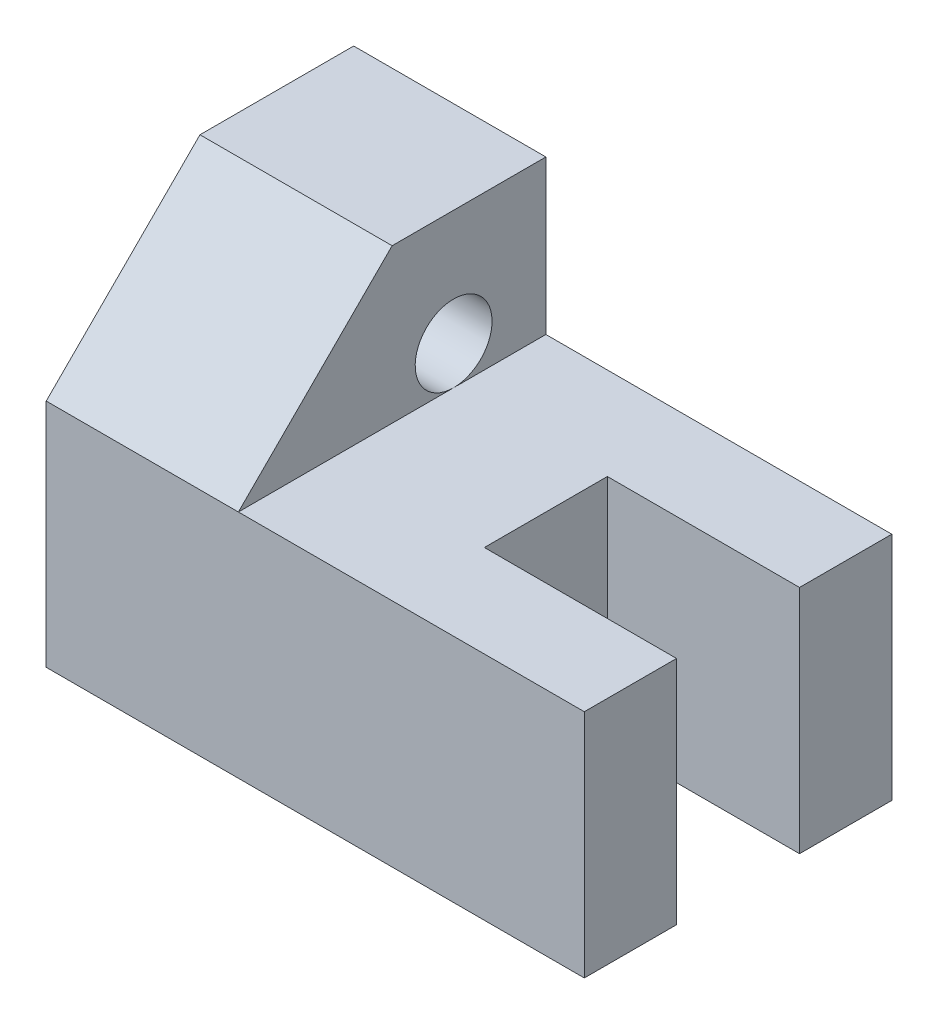
ISO-10303-21;
HEADER;
FILE_DESCRIPTION(('STEP AP214'),'2;1');
FILE_NAME('part.step','',(''),(''),'','','');
FILE_SCHEMA(('AUTOMOTIVE_DESIGN { 1 0 10303 214 1 1 1 1 }'));
ENDSEC;
DATA;
#1=APPLICATION_CONTEXT('core data for automotive mechanical design processes');
#2=APPLICATION_PROTOCOL_DEFINITION('international standard','automotive_design',2000,#1);
#3=PRODUCT_CONTEXT('',#1,'mechanical');
#4=PRODUCT('Part','Part','',(#3));
#5=PRODUCT_RELATED_PRODUCT_CATEGORY('part','',(#4));
#6=PRODUCT_DEFINITION_FORMATION('','',#4);
#7=PRODUCT_DEFINITION_CONTEXT('part definition',#1,'design');
#8=PRODUCT_DEFINITION('design','',#6,#7);
#9=PRODUCT_DEFINITION_SHAPE('','',#8);
#10=(LENGTH_UNIT() NAMED_UNIT(*) SI_UNIT(.MILLI.,.METRE.));
#11=(NAMED_UNIT(*) PLANE_ANGLE_UNIT() SI_UNIT($,.RADIAN.));
#12=(NAMED_UNIT(*) SI_UNIT($,.STERADIAN.) SOLID_ANGLE_UNIT());
#13=UNCERTAINTY_MEASURE_WITH_UNIT(LENGTH_MEASURE(1.E-05),#10,'distance_accuracy_value','');
#14=(GEOMETRIC_REPRESENTATION_CONTEXT(3) GLOBAL_UNCERTAINTY_ASSIGNED_CONTEXT((#13)) GLOBAL_UNIT_ASSIGNED_CONTEXT((#10,
#11,#12)) REPRESENTATION_CONTEXT('',''));
#15=CARTESIAN_POINT('',(0.,0.,0.));
#16=DIRECTION('',(0.,0.,1.));
#17=DIRECTION('',(1.,0.,0.));
#18=AXIS2_PLACEMENT_3D('',#15,#16,#17);
#19=CARTESIAN_POINT('',(0.,30.,0.));
#20=DIRECTION('',(0.,-1.,0.));
#21=DIRECTION('',(0.,0.,-1.));
#22=AXIS2_PLACEMENT_3D('',#19,#20,#21);
#23=PLANE('',#22);
#24=DIRECTION('',(0.,0.,-1.));
#25=VECTOR('',#24,1.);
#26=CARTESIAN_POINT('',(25.,30.,0.));
#27=LINE('',#26,#25);
#28=CARTESIAN_POINT('',(25.,30.,12.));
#29=VERTEX_POINT('',#28);
#30=CARTESIAN_POINT('',(25.,30.,0.));
#31=VERTEX_POINT('',#30);
#32=EDGE_CURVE('E141',#29,#31,#27,.T.);
#33=ORIENTED_EDGE('',*,*,#32,.F.);
#34=CARTESIAN_POINT('',(25.,30.,40.));
#35=VERTEX_POINT('',#34);
#36=EDGE_CURVE('E73',#35,#29,#27,.T.);
#37=ORIENTED_EDGE('',*,*,#36,.F.);
#38=DIRECTION('',(1.,0.,0.));
#39=VECTOR('',#38,1.);
#40=CARTESIAN_POINT('',(70.,30.,40.));
#41=LINE('',#40,#39);
#42=CARTESIAN_POINT('',(70.,30.,40.));
#43=VERTEX_POINT('',#42);
#44=EDGE_CURVE('E215',#35,#43,#41,.T.);
#45=ORIENTED_EDGE('',*,*,#44,.T.);
#46=DIRECTION('',(0.,0.,-1.));
#47=VECTOR('',#46,1.);
#48=CARTESIAN_POINT('',(70.,30.,0.));
#49=LINE('',#48,#47);
#50=CARTESIAN_POINT('',(70.,30.,28.));
#51=VERTEX_POINT('',#50);
#52=EDGE_CURVE('E216',#43,#51,#49,.T.);
#53=ORIENTED_EDGE('',*,*,#52,.T.);
#54=DIRECTION('',(1.,0.,0.));
#55=VECTOR('',#54,1.);
#56=CARTESIAN_POINT('',(70.,30.,28.));
#57=LINE('',#56,#55);
#58=CARTESIAN_POINT('',(45.,30.,28.));
#59=VERTEX_POINT('',#58);
#60=EDGE_CURVE('E192',#59,#51,#57,.T.);
#61=ORIENTED_EDGE('',*,*,#60,.F.);
#62=DIRECTION('',(0.,0.,1.));
#63=VECTOR('',#62,1.);
#64=CARTESIAN_POINT('',(45.,30.,28.));
#65=LINE('',#64,#63);
#66=CARTESIAN_POINT('',(45.,30.,12.));
#67=VERTEX_POINT('',#66);
#68=EDGE_CURVE('E174',#67,#59,#65,.T.);
#69=ORIENTED_EDGE('',*,*,#68,.F.);
#70=DIRECTION('',(-1.,0.,0.));
#71=VECTOR('',#70,1.);
#72=CARTESIAN_POINT('',(45.,30.,12.));
#73=LINE('',#72,#71);
#74=CARTESIAN_POINT('',(70.,30.,12.));
#75=VERTEX_POINT('',#74);
#76=EDGE_CURVE('E180',#75,#67,#73,.T.);
#77=ORIENTED_EDGE('',*,*,#76,.F.);
#78=CARTESIAN_POINT('',(70.,30.,0.));
#79=VERTEX_POINT('',#78);
#80=EDGE_CURVE('E214',#75,#79,#49,.T.);
#81=ORIENTED_EDGE('',*,*,#80,.T.);
#82=DIRECTION('',(-1.,0.,0.));
#83=VECTOR('',#82,1.);
#84=CARTESIAN_POINT('',(0.,30.,0.));
#85=LINE('',#84,#83);
#86=EDGE_CURVE('E220',#79,#31,#85,.T.);
#87=ORIENTED_EDGE('',*,*,#86,.T.);
#88=EDGE_LOOP('',(#33,#37,#45,#53,#61,#69,#77,#81,#87));
#89=FACE_BOUND('',#88,.T.);
#90=ADVANCED_FACE('F51',(#89),#23,.F.);
#91=CARTESIAN_POINT('',(70.,30.,0.));
#92=DIRECTION('',(-1.,0.,0.));
#93=DIRECTION('',(0.,0.,1.));
#94=AXIS2_PLACEMENT_3D('',#91,#92,#93);
#95=PLANE('',#94);
#96=ORIENTED_EDGE('',*,*,#80,.F.);
#97=DIRECTION('',(0.,1.,0.));
#98=VECTOR('',#97,1.);
#99=CARTESIAN_POINT('',(70.,0.,12.));
#100=LINE('',#99,#98);
#101=CARTESIAN_POINT('',(70.,0.,12.));
#102=VERTEX_POINT('',#101);
#103=EDGE_CURVE('E201',#102,#75,#100,.T.);
#104=ORIENTED_EDGE('',*,*,#103,.F.);
#105=DIRECTION('',(0.,0.,-1.));
#106=VECTOR('',#105,1.);
#107=CARTESIAN_POINT('',(70.,0.,0.));
#108=LINE('',#107,#106);
#109=CARTESIAN_POINT('',(70.,0.,0.));
#110=VERTEX_POINT('',#109);
#111=EDGE_CURVE('E229',#102,#110,#108,.T.);
#112=ORIENTED_EDGE('',*,*,#111,.T.);
#113=DIRECTION('',(0.,-1.,0.));
#114=VECTOR('',#113,1.);
#115=CARTESIAN_POINT('',(70.,30.,0.));
#116=LINE('',#115,#114);
#117=EDGE_CURVE('E239',#79,#110,#116,.T.);
#118=ORIENTED_EDGE('',*,*,#117,.F.);
#119=EDGE_LOOP('',(#96,#104,#112,#118));
#120=FACE_BOUND('',#119,.T.);
#121=ADVANCED_FACE('F279',(#120),#95,.F.);
#122=CARTESIAN_POINT('',(0.,30.,40.));
#123=DIRECTION('',(1.,0.,0.));
#124=DIRECTION('',(0.,0.,-1.));
#125=AXIS2_PLACEMENT_3D('',#122,#123,#124);
#126=PLANE('',#125);
#127=CARTESIAN_POINT('',(0.,35.,12.));
#128=DIRECTION('',(1.,0.,0.));
#129=DIRECTION('',(0.,0.,-1.));
#130=AXIS2_PLACEMENT_3D('',#127,#128,#129);
#131=CIRCLE('',#130,5.);
#132=CARTESIAN_POINT('',(0.,35.,7.));
#133=VERTEX_POINT('',#132);
#134=EDGE_CURVE('E440',#133,#133,#131,.T.);
#135=ORIENTED_EDGE('',*,*,#134,.T.);
#136=EDGE_LOOP('',(#135));
#137=FACE_BOUND('',#136,.T.);
#138=DIRECTION('',(0.,0.,1.));
#139=VECTOR('',#138,1.);
#140=CARTESIAN_POINT('',(0.,0.,40.));
#141=LINE('',#140,#139);
#142=CARTESIAN_POINT('',(0.,0.,0.));
#143=VERTEX_POINT('',#142);
#144=CARTESIAN_POINT('',(0.,0.,40.));
#145=VERTEX_POINT('',#144);
#146=EDGE_CURVE('E200',#143,#145,#141,.T.);
#147=ORIENTED_EDGE('',*,*,#146,.T.);
#148=DIRECTION('',(0.,-1.,0.));
#149=VECTOR('',#148,1.);
#150=CARTESIAN_POINT('',(0.,30.,40.));
#151=LINE('',#150,#149);
#152=CARTESIAN_POINT('',(0.,30.,40.));
#153=VERTEX_POINT('',#152);
#154=EDGE_CURVE('E11',#153,#145,#151,.T.);
#155=ORIENTED_EDGE('',*,*,#154,.F.);
#156=DIRECTION('',(0.,-0.707106781186548,0.707106781186547));
#157=VECTOR('',#156,1.);
#158=CARTESIAN_POINT('',(0.,30.,40.));
#159=LINE('',#158,#157);
#160=CARTESIAN_POINT('',(0.,50.,20.));
#161=VERTEX_POINT('',#160);
#162=EDGE_CURVE('E147',#161,#153,#159,.T.);
#163=ORIENTED_EDGE('',*,*,#162,.F.);
#164=DIRECTION('',(0.,0.,1.));
#165=VECTOR('',#164,1.);
#166=CARTESIAN_POINT('',(0.,50.,20.));
#167=LINE('',#166,#165);
#168=CARTESIAN_POINT('',(0.,50.,0.));
#169=VERTEX_POINT('',#168);
#170=EDGE_CURVE('E265',#169,#161,#167,.T.);
#171=ORIENTED_EDGE('',*,*,#170,.F.);
#172=DIRECTION('',(0.,-1.,0.));
#173=VECTOR('',#172,1.);
#174=CARTESIAN_POINT('',(0.,30.,0.));
#175=LINE('',#174,#173);
#176=EDGE_CURVE('E161',#169,#143,#175,.T.);
#177=ORIENTED_EDGE('',*,*,#176,.T.);
#178=EDGE_LOOP('',(#147,#155,#163,#171,#177));
#179=FACE_BOUND('',#178,.T.);
#180=ADVANCED_FACE('F54',(#137,#179),#126,.F.);
#181=CARTESIAN_POINT('',(70.,30.,40.));
#182=DIRECTION('',(0.,0.,-1.));
#183=DIRECTION('',(-1.,0.,0.));
#184=AXIS2_PLACEMENT_3D('',#181,#182,#183);
#185=PLANE('',#184);
#186=DIRECTION('',(1.,0.,0.));
#187=VECTOR('',#186,1.);
#188=CARTESIAN_POINT('',(70.,0.,40.));
#189=LINE('',#188,#187);
#190=CARTESIAN_POINT('',(70.,0.,40.));
#191=VERTEX_POINT('',#190);
#192=EDGE_CURVE('E226',#145,#191,#189,.T.);
#193=ORIENTED_EDGE('',*,*,#192,.T.);
#194=DIRECTION('',(0.,-1.,0.));
#195=VECTOR('',#194,1.);
#196=CARTESIAN_POINT('',(70.,30.,40.));
#197=LINE('',#196,#195);
#198=EDGE_CURVE('E62',#43,#191,#197,.T.);
#199=ORIENTED_EDGE('',*,*,#198,.F.);
#200=ORIENTED_EDGE('',*,*,#44,.F.);
#201=EDGE_CURVE('E210',#153,#35,#41,.T.);
#202=ORIENTED_EDGE('',*,*,#201,.F.);
#203=ORIENTED_EDGE('',*,*,#154,.T.);
#204=EDGE_LOOP('',(#193,#199,#200,#202,#203));
#205=FACE_BOUND('',#204,.T.);
#206=ADVANCED_FACE('F273',(#205),#185,.F.);
#207=CARTESIAN_POINT('',(70.,0.,28.));
#208=VERTEX_POINT('',#207);
#209=EDGE_CURVE('E230',#191,#208,#108,.T.);
#210=ORIENTED_EDGE('',*,*,#209,.T.);
#211=DIRECTION('',(0.,1.,0.));
#212=VECTOR('',#211,1.);
#213=CARTESIAN_POINT('',(70.,0.,28.));
#214=LINE('',#213,#212);
#215=EDGE_CURVE('E204',#208,#51,#214,.T.);
#216=ORIENTED_EDGE('',*,*,#215,.T.);
#217=ORIENTED_EDGE('',*,*,#52,.F.);
#218=ORIENTED_EDGE('',*,*,#198,.T.);
#219=EDGE_LOOP('',(#210,#216,#217,#218));
#220=FACE_BOUND('',#219,.T.);
#221=ADVANCED_FACE('F248',(#220),#95,.F.);
#222=CARTESIAN_POINT('',(0.,30.,0.));
#223=DIRECTION('',(0.,0.,1.));
#224=DIRECTION('',(1.,0.,0.));
#225=AXIS2_PLACEMENT_3D('',#222,#223,#224);
#226=PLANE('',#225);
#227=ORIENTED_EDGE('',*,*,#176,.F.);
#228=DIRECTION('',(-1.,0.,0.));
#229=VECTOR('',#228,1.);
#230=CARTESIAN_POINT('',(25.,50.,0.));
#231=LINE('',#230,#229);
#232=CARTESIAN_POINT('',(25.,50.,0.));
#233=VERTEX_POINT('',#232);
#234=EDGE_CURVE('E152',#233,#169,#231,.T.);
#235=ORIENTED_EDGE('',*,*,#234,.F.);
#236=DIRECTION('',(0.,1.,0.));
#237=VECTOR('',#236,1.);
#238=CARTESIAN_POINT('',(25.,50.,0.));
#239=LINE('',#238,#237);
#240=EDGE_CURVE('E135',#31,#233,#239,.T.);
#241=ORIENTED_EDGE('',*,*,#240,.F.);
#242=ORIENTED_EDGE('',*,*,#86,.F.);
#243=ORIENTED_EDGE('',*,*,#117,.T.);
#244=DIRECTION('',(-1.,0.,0.));
#245=VECTOR('',#244,1.);
#246=CARTESIAN_POINT('',(0.,0.,0.));
#247=LINE('',#246,#245);
#248=EDGE_CURVE('E234',#110,#143,#247,.T.);
#249=ORIENTED_EDGE('',*,*,#248,.T.);
#250=EDGE_LOOP('',(#227,#235,#241,#242,#243,#249));
#251=FACE_BOUND('',#250,.T.);
#252=ADVANCED_FACE('F159',(#251),#226,.F.);
#253=CARTESIAN_POINT('',(0.,0.,0.));
#254=DIRECTION('',(0.,-1.,0.));
#255=DIRECTION('',(0.,0.,-1.));
#256=AXIS2_PLACEMENT_3D('',#253,#254,#255);
#257=PLANE('',#256);
#258=ORIENTED_EDGE('',*,*,#146,.F.);
#259=ORIENTED_EDGE('',*,*,#248,.F.);
#260=ORIENTED_EDGE('',*,*,#111,.F.);
#261=DIRECTION('',(-1.,0.,0.));
#262=VECTOR('',#261,1.);
#263=CARTESIAN_POINT('',(45.,0.,12.));
#264=LINE('',#263,#262);
#265=CARTESIAN_POINT('',(45.,0.,12.));
#266=VERTEX_POINT('',#265);
#267=EDGE_CURVE('E184',#102,#266,#264,.T.);
#268=ORIENTED_EDGE('',*,*,#267,.T.);
#269=DIRECTION('',(0.,0.,1.));
#270=VECTOR('',#269,1.);
#271=CARTESIAN_POINT('',(45.,0.,28.));
#272=LINE('',#271,#270);
#273=CARTESIAN_POINT('',(45.,0.,28.));
#274=VERTEX_POINT('',#273);
#275=EDGE_CURVE('E175',#266,#274,#272,.T.);
#276=ORIENTED_EDGE('',*,*,#275,.T.);
#277=DIRECTION('',(1.,0.,0.));
#278=VECTOR('',#277,1.);
#279=CARTESIAN_POINT('',(70.,0.,28.));
#280=LINE('',#279,#278);
#281=EDGE_CURVE('E179',#274,#208,#280,.T.);
#282=ORIENTED_EDGE('',*,*,#281,.T.);
#283=ORIENTED_EDGE('',*,*,#209,.F.);
#284=ORIENTED_EDGE('',*,*,#192,.F.);
#285=EDGE_LOOP('',(#258,#259,#260,#268,#276,#282,#283,#284));
#286=FACE_BOUND('',#285,.T.);
#287=ADVANCED_FACE('F252',(#286),#257,.T.);
#288=CARTESIAN_POINT('',(45.,0.,28.));
#289=DIRECTION('',(-1.,0.,0.));
#290=DIRECTION('',(0.,0.,1.));
#291=AXIS2_PLACEMENT_3D('',#288,#289,#290);
#292=PLANE('',#291);
#293=ORIENTED_EDGE('',*,*,#68,.T.);
#294=DIRECTION('',(0.,1.,0.));
#295=VECTOR('',#294,1.);
#296=CARTESIAN_POINT('',(45.,0.,28.));
#297=LINE('',#296,#295);
#298=EDGE_CURVE('E188',#274,#59,#297,.T.);
#299=ORIENTED_EDGE('',*,*,#298,.F.);
#300=ORIENTED_EDGE('',*,*,#275,.F.);
#301=DIRECTION('',(0.,1.,0.));
#302=VECTOR('',#301,1.);
#303=CARTESIAN_POINT('',(45.,0.,12.));
#304=LINE('',#303,#302);
#305=EDGE_CURVE('E198',#266,#67,#304,.T.);
#306=ORIENTED_EDGE('',*,*,#305,.T.);
#307=EDGE_LOOP('',(#293,#299,#300,#306));
#308=FACE_BOUND('',#307,.T.);
#309=ADVANCED_FACE('F292',(#308),#292,.F.);
#310=CARTESIAN_POINT('',(45.,0.,12.));
#311=DIRECTION('',(0.,0.,-1.));
#312=DIRECTION('',(-1.,0.,0.));
#313=AXIS2_PLACEMENT_3D('',#310,#311,#312);
#314=PLANE('',#313);
#315=ORIENTED_EDGE('',*,*,#76,.T.);
#316=ORIENTED_EDGE('',*,*,#305,.F.);
#317=ORIENTED_EDGE('',*,*,#267,.F.);
#318=ORIENTED_EDGE('',*,*,#103,.T.);
#319=EDGE_LOOP('',(#315,#316,#317,#318));
#320=FACE_BOUND('',#319,.T.);
#321=ADVANCED_FACE('F307',(#320),#314,.F.);
#322=CARTESIAN_POINT('',(70.,0.,28.));
#323=DIRECTION('',(0.,0.,1.));
#324=DIRECTION('',(1.,0.,0.));
#325=AXIS2_PLACEMENT_3D('',#322,#323,#324);
#326=PLANE('',#325);
#327=ORIENTED_EDGE('',*,*,#60,.T.);
#328=ORIENTED_EDGE('',*,*,#215,.F.);
#329=ORIENTED_EDGE('',*,*,#281,.F.);
#330=ORIENTED_EDGE('',*,*,#298,.T.);
#331=EDGE_LOOP('',(#327,#328,#329,#330));
#332=FACE_BOUND('',#331,.T.);
#333=ADVANCED_FACE('F256',(#332),#326,.F.);
#334=CARTESIAN_POINT('',(25.,0.,0.));
#335=DIRECTION('',(-1.,0.,0.));
#336=DIRECTION('',(0.,0.,1.));
#337=AXIS2_PLACEMENT_3D('',#334,#335,#336);
#338=PLANE('',#337);
#339=ORIENTED_EDGE('',*,*,#36,.T.);
#340=CARTESIAN_POINT('',(25.,35.,12.));
#341=DIRECTION('',(-1.,0.,0.));
#342=DIRECTION('',(0.,0.,1.));
#343=AXIS2_PLACEMENT_3D('',#340,#341,#342);
#344=CIRCLE('',#343,5.);
#345=EDGE_CURVE('E56',#29,#29,#344,.F.);
#346=ORIENTED_EDGE('',*,*,#345,.F.);
#347=ORIENTED_EDGE('',*,*,#32,.T.);
#348=ORIENTED_EDGE('',*,*,#240,.T.);
#349=DIRECTION('',(0.,0.,1.));
#350=VECTOR('',#349,1.);
#351=CARTESIAN_POINT('',(25.,50.,20.));
#352=LINE('',#351,#350);
#353=CARTESIAN_POINT('',(25.,50.,20.));
#354=VERTEX_POINT('',#353);
#355=EDGE_CURVE('E139',#233,#354,#352,.T.);
#356=ORIENTED_EDGE('',*,*,#355,.T.);
#357=DIRECTION('',(0.,-0.707106781186548,0.707106781186547));
#358=VECTOR('',#357,1.);
#359=CARTESIAN_POINT('',(25.,30.,40.));
#360=LINE('',#359,#358);
#361=EDGE_CURVE('E157',#354,#35,#360,.T.);
#362=ORIENTED_EDGE('',*,*,#361,.T.);
#363=EDGE_LOOP('',(#339,#346,#347,#348,#356,#362));
#364=FACE_BOUND('',#363,.T.);
#365=ADVANCED_FACE('F137',(#364),#338,.F.);
#366=CARTESIAN_POINT('',(25.,50.,20.));
#367=DIRECTION('',(0.,-1.,0.));
#368=DIRECTION('',(0.,0.,-1.));
#369=AXIS2_PLACEMENT_3D('',#366,#367,#368);
#370=PLANE('',#369);
#371=ORIENTED_EDGE('',*,*,#170,.T.);
#372=DIRECTION('',(-1.,0.,0.));
#373=VECTOR('',#372,1.);
#374=CARTESIAN_POINT('',(25.,50.,20.));
#375=LINE('',#374,#373);
#376=EDGE_CURVE('E154',#354,#161,#375,.T.);
#377=ORIENTED_EDGE('',*,*,#376,.F.);
#378=ORIENTED_EDGE('',*,*,#355,.F.);
#379=ORIENTED_EDGE('',*,*,#234,.T.);
#380=EDGE_LOOP('',(#371,#377,#378,#379));
#381=FACE_BOUND('',#380,.T.);
#382=ADVANCED_FACE('F151',(#381),#370,.F.);
#383=CARTESIAN_POINT('',(25.,30.,40.));
#384=DIRECTION('',(0.,-0.707106781186547,-0.707106781186548));
#385=DIRECTION('',(0.,0.707106781186548,-0.707106781186547));
#386=AXIS2_PLACEMENT_3D('',#383,#384,#385);
#387=PLANE('',#386);
#388=ORIENTED_EDGE('',*,*,#162,.T.);
#389=ORIENTED_EDGE('',*,*,#201,.T.);
#390=ORIENTED_EDGE('',*,*,#361,.F.);
#391=ORIENTED_EDGE('',*,*,#376,.T.);
#392=EDGE_LOOP('',(#388,#389,#390,#391));
#393=FACE_BOUND('',#392,.T.);
#394=ADVANCED_FACE('F271',(#393),#387,.F.);
#395=CARTESIAN_POINT('',(70.,35.,12.));
#396=DIRECTION('',(-1.,0.,0.));
#397=DIRECTION('',(0.,0.,1.));
#398=AXIS2_PLACEMENT_3D('',#395,#396,#397);
#399=CYLINDRICAL_SURFACE('',#398,5.);
#400=ORIENTED_EDGE('',*,*,#134,.F.);
#401=EDGE_LOOP('',(#400));
#402=FACE_BOUND('',#401,.T.);
#403=ORIENTED_EDGE('',*,*,#345,.T.);
#404=EDGE_LOOP('',(#403));
#405=FACE_BOUND('',#404,.T.);
#406=ADVANCED_FACE('F328',(#402,#405),#399,.F.);
#407=CLOSED_SHELL('',(#90,#121,#180,#206,#221,#252,#287,#309,#321,#333,#365,#382,#394,#406));
#408=MANIFOLD_SOLID_BREP('B2',#407);
#409=ADVANCED_BREP_SHAPE_REPRESENTATION('',(#18,#408),#14);
#410=SHAPE_DEFINITION_REPRESENTATION(#9,#409);
ENDSEC;
END-ISO-10303-21;
